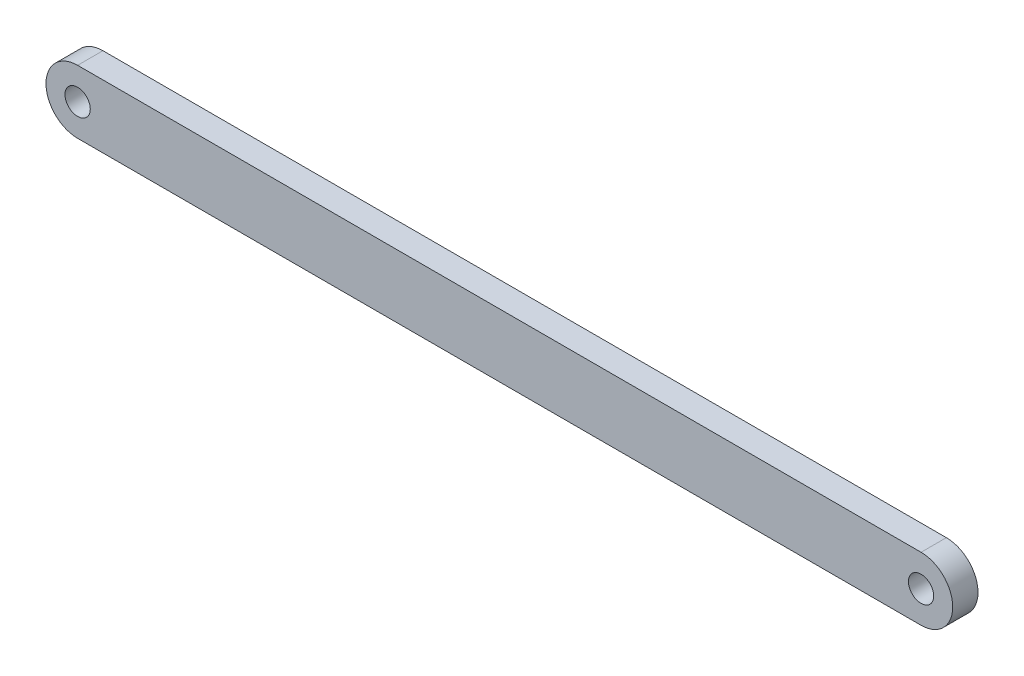
ISO-10303-21;
HEADER;
FILE_DESCRIPTION(('STEP AP214'),'2;1');
FILE_NAME('part.step','',(''),(''),'','','');
FILE_SCHEMA(('AUTOMOTIVE_DESIGN { 1 0 10303 214 1 1 1 1 }'));
ENDSEC;
DATA;
#1=APPLICATION_CONTEXT('core data for automotive mechanical design processes');
#2=APPLICATION_PROTOCOL_DEFINITION('international standard','automotive_design',2000,#1);
#3=PRODUCT_CONTEXT('',#1,'mechanical');
#4=PRODUCT('Part','Part','',(#3));
#5=PRODUCT_RELATED_PRODUCT_CATEGORY('part','',(#4));
#6=PRODUCT_DEFINITION_FORMATION('','',#4);
#7=PRODUCT_DEFINITION_CONTEXT('part definition',#1,'design');
#8=PRODUCT_DEFINITION('design','',#6,#7);
#9=PRODUCT_DEFINITION_SHAPE('','',#8);
#10=(LENGTH_UNIT() NAMED_UNIT(*) SI_UNIT(.MILLI.,.METRE.));
#11=(NAMED_UNIT(*) PLANE_ANGLE_UNIT() SI_UNIT($,.RADIAN.));
#12=(NAMED_UNIT(*) SI_UNIT($,.STERADIAN.) SOLID_ANGLE_UNIT());
#13=UNCERTAINTY_MEASURE_WITH_UNIT(LENGTH_MEASURE(1.E-05),#10,'distance_accuracy_value','');
#14=(GEOMETRIC_REPRESENTATION_CONTEXT(3) GLOBAL_UNCERTAINTY_ASSIGNED_CONTEXT((#13)) GLOBAL_UNIT_ASSIGNED_CONTEXT((#10,
#11,#12)) REPRESENTATION_CONTEXT('',''));
#15=CARTESIAN_POINT('',(0.,0.,0.));
#16=DIRECTION('',(0.,0.,1.));
#17=DIRECTION('',(1.,0.,0.));
#18=AXIS2_PLACEMENT_3D('',#15,#16,#17);
#19=CARTESIAN_POINT('',(0.,0.,3.));
#20=DIRECTION('',(0.,0.,-1.));
#21=DIRECTION('',(-1.,0.,0.));
#22=AXIS2_PLACEMENT_3D('',#19,#20,#21);
#23=CYLINDRICAL_SURFACE('',#22,3.75);
#24=CARTESIAN_POINT('',(0.,0.,0.));
#25=DIRECTION('',(0.,0.,1.));
#26=DIRECTION('',(1.,0.,0.));
#27=AXIS2_PLACEMENT_3D('',#24,#25,#26);
#28=CIRCLE('',#27,3.75);
#29=CARTESIAN_POINT('',(0.,3.75,0.));
#30=VERTEX_POINT('',#29);
#31=CARTESIAN_POINT('',(0.,-3.75,0.));
#32=VERTEX_POINT('',#31);
#33=EDGE_CURVE('E121',#30,#32,#28,.T.);
#34=ORIENTED_EDGE('',*,*,#33,.T.);
#35=DIRECTION('',(0.,0.,-1.));
#36=VECTOR('',#35,1.);
#37=CARTESIAN_POINT('',(0.,-3.75,3.));
#38=LINE('',#37,#36);
#39=CARTESIAN_POINT('',(0.,-3.75,3.));
#40=VERTEX_POINT('',#39);
#41=EDGE_CURVE('E11',#40,#32,#38,.T.);
#42=ORIENTED_EDGE('',*,*,#41,.F.);
#43=CARTESIAN_POINT('',(0.,0.,3.));
#44=DIRECTION('',(0.,0.,1.));
#45=DIRECTION('',(1.,0.,0.));
#46=AXIS2_PLACEMENT_3D('',#43,#44,#45);
#47=CIRCLE('',#46,3.75);
#48=CARTESIAN_POINT('',(0.,3.75,3.));
#49=VERTEX_POINT('',#48);
#50=EDGE_CURVE('E97',#49,#40,#47,.T.);
#51=ORIENTED_EDGE('',*,*,#50,.F.);
#52=DIRECTION('',(0.,0.,-1.));
#53=VECTOR('',#52,1.);
#54=CARTESIAN_POINT('',(0.,3.75,3.));
#55=LINE('',#54,#53);
#56=EDGE_CURVE('E116',#49,#30,#55,.T.);
#57=ORIENTED_EDGE('',*,*,#56,.T.);
#58=EDGE_LOOP('',(#34,#42,#51,#57));
#59=FACE_BOUND('',#58,.T.);
#60=ADVANCED_FACE('F43',(#59),#23,.T.);
#61=CARTESIAN_POINT('',(0.,-3.75,3.));
#62=DIRECTION('',(0.,1.,0.));
#63=DIRECTION('',(0.,0.,1.));
#64=AXIS2_PLACEMENT_3D('',#61,#62,#63);
#65=PLANE('',#64);
#66=DIRECTION('',(1.,0.,0.));
#67=VECTOR('',#66,1.);
#68=CARTESIAN_POINT('',(0.,-3.75,0.));
#69=LINE('',#68,#67);
#70=CARTESIAN_POINT('',(100.,-3.75,0.));
#71=VERTEX_POINT('',#70);
#72=EDGE_CURVE('E102',#32,#71,#69,.T.);
#73=ORIENTED_EDGE('',*,*,#72,.T.);
#74=DIRECTION('',(0.,0.,-1.));
#75=VECTOR('',#74,1.);
#76=CARTESIAN_POINT('',(100.,-3.75,3.));
#77=LINE('',#76,#75);
#78=CARTESIAN_POINT('',(100.,-3.75,3.));
#79=VERTEX_POINT('',#78);
#80=EDGE_CURVE('E53',#79,#71,#77,.T.);
#81=ORIENTED_EDGE('',*,*,#80,.F.);
#82=DIRECTION('',(1.,0.,0.));
#83=VECTOR('',#82,1.);
#84=CARTESIAN_POINT('',(0.,-3.75,3.));
#85=LINE('',#84,#83);
#86=EDGE_CURVE('E91',#40,#79,#85,.T.);
#87=ORIENTED_EDGE('',*,*,#86,.F.);
#88=ORIENTED_EDGE('',*,*,#41,.T.);
#89=EDGE_LOOP('',(#73,#81,#87,#88));
#90=FACE_BOUND('',#89,.T.);
#91=ADVANCED_FACE('F101',(#90),#65,.F.);
#92=CARTESIAN_POINT('',(100.,0.,3.));
#93=DIRECTION('',(0.,0.,-1.));
#94=DIRECTION('',(-1.,0.,0.));
#95=AXIS2_PLACEMENT_3D('',#92,#93,#94);
#96=CYLINDRICAL_SURFACE('',#95,3.75000000000001);
#97=CARTESIAN_POINT('',(100.,0.,0.));
#98=DIRECTION('',(0.,0.,1.));
#99=DIRECTION('',(1.,0.,0.));
#100=AXIS2_PLACEMENT_3D('',#97,#98,#99);
#101=CIRCLE('',#100,3.75000000000001);
#102=CARTESIAN_POINT('',(100.,3.75,0.));
#103=VERTEX_POINT('',#102);
#104=EDGE_CURVE('E78',#71,#103,#101,.T.);
#105=ORIENTED_EDGE('',*,*,#104,.T.);
#106=DIRECTION('',(0.,0.,-1.));
#107=VECTOR('',#106,1.);
#108=CARTESIAN_POINT('',(100.,3.75,3.));
#109=LINE('',#108,#107);
#110=CARTESIAN_POINT('',(100.,3.75,3.));
#111=VERTEX_POINT('',#110);
#112=EDGE_CURVE('E104',#111,#103,#109,.T.);
#113=ORIENTED_EDGE('',*,*,#112,.F.);
#114=CARTESIAN_POINT('',(100.,0.,3.));
#115=DIRECTION('',(0.,0.,1.));
#116=DIRECTION('',(1.,0.,0.));
#117=AXIS2_PLACEMENT_3D('',#114,#115,#116);
#118=CIRCLE('',#117,3.75000000000001);
#119=EDGE_CURVE('E95',#79,#111,#118,.T.);
#120=ORIENTED_EDGE('',*,*,#119,.F.);
#121=ORIENTED_EDGE('',*,*,#80,.T.);
#122=EDGE_LOOP('',(#105,#113,#120,#121));
#123=FACE_BOUND('',#122,.T.);
#124=ADVANCED_FACE('F105',(#123),#96,.T.);
#125=CARTESIAN_POINT('',(0.,3.75,3.));
#126=DIRECTION('',(0.,-1.,0.));
#127=DIRECTION('',(0.,0.,-1.));
#128=AXIS2_PLACEMENT_3D('',#125,#126,#127);
#129=PLANE('',#128);
#130=DIRECTION('',(-1.,0.,0.));
#131=VECTOR('',#130,1.);
#132=CARTESIAN_POINT('',(0.,3.75,0.));
#133=LINE('',#132,#131);
#134=EDGE_CURVE('E84',#103,#30,#133,.T.);
#135=ORIENTED_EDGE('',*,*,#134,.T.);
#136=ORIENTED_EDGE('',*,*,#56,.F.);
#137=DIRECTION('',(-1.,0.,0.));
#138=VECTOR('',#137,1.);
#139=CARTESIAN_POINT('',(0.,3.75,3.));
#140=LINE('',#139,#138);
#141=EDGE_CURVE('E61',#111,#49,#140,.T.);
#142=ORIENTED_EDGE('',*,*,#141,.F.);
#143=ORIENTED_EDGE('',*,*,#112,.T.);
#144=EDGE_LOOP('',(#135,#136,#142,#143));
#145=FACE_BOUND('',#144,.T.);
#146=ADVANCED_FACE('F139',(#145),#129,.F.);
#147=CARTESIAN_POINT('',(0.,0.,3.));
#148=DIRECTION('',(0.,0.,-1.));
#149=DIRECTION('',(-1.,0.,0.));
#150=AXIS2_PLACEMENT_3D('',#147,#148,#149);
#151=CYLINDRICAL_SURFACE('',#150,1.5);
#152=CARTESIAN_POINT('',(0.,0.,3.));
#153=DIRECTION('',(0.,0.,1.));
#154=DIRECTION('',(1.,0.,0.));
#155=AXIS2_PLACEMENT_3D('',#152,#153,#154);
#156=CIRCLE('',#155,1.5);
#157=CARTESIAN_POINT('',(1.5,0.,3.));
#158=VERTEX_POINT('',#157);
#159=EDGE_CURVE('E135',#158,#158,#156,.T.);
#160=ORIENTED_EDGE('',*,*,#159,.T.);
#161=EDGE_LOOP('',(#160));
#162=FACE_BOUND('',#161,.T.);
#163=CARTESIAN_POINT('',(0.,0.,0.));
#164=DIRECTION('',(0.,0.,1.));
#165=DIRECTION('',(1.,0.,0.));
#166=AXIS2_PLACEMENT_3D('',#163,#164,#165);
#167=CIRCLE('',#166,1.5);
#168=CARTESIAN_POINT('',(1.5,0.,0.));
#169=VERTEX_POINT('',#168);
#170=EDGE_CURVE('E117',#169,#169,#167,.T.);
#171=ORIENTED_EDGE('',*,*,#170,.F.);
#172=EDGE_LOOP('',(#171));
#173=FACE_BOUND('',#172,.T.);
#174=ADVANCED_FACE('F45',(#162,#173),#151,.F.);
#175=CARTESIAN_POINT('',(100.,0.,3.));
#176=DIRECTION('',(0.,0.,-1.));
#177=DIRECTION('',(-1.,0.,0.));
#178=AXIS2_PLACEMENT_3D('',#175,#176,#177);
#179=CYLINDRICAL_SURFACE('',#178,1.5);
#180=CARTESIAN_POINT('',(100.,0.,3.));
#181=DIRECTION('',(0.,0.,1.));
#182=DIRECTION('',(1.,0.,0.));
#183=AXIS2_PLACEMENT_3D('',#180,#181,#182);
#184=CIRCLE('',#183,1.5);
#185=CARTESIAN_POINT('',(101.5,0.,3.));
#186=VERTEX_POINT('',#185);
#187=EDGE_CURVE('E109',#186,#186,#184,.T.);
#188=ORIENTED_EDGE('',*,*,#187,.T.);
#189=EDGE_LOOP('',(#188));
#190=FACE_BOUND('',#189,.T.);
#191=CARTESIAN_POINT('',(100.,0.,0.));
#192=DIRECTION('',(0.,0.,1.));
#193=DIRECTION('',(1.,0.,0.));
#194=AXIS2_PLACEMENT_3D('',#191,#192,#193);
#195=CIRCLE('',#194,1.5);
#196=CARTESIAN_POINT('',(101.5,0.,0.));
#197=VERTEX_POINT('',#196);
#198=EDGE_CURVE('E131',#197,#197,#195,.T.);
#199=ORIENTED_EDGE('',*,*,#198,.F.);
#200=EDGE_LOOP('',(#199));
#201=FACE_BOUND('',#200,.T.);
#202=ADVANCED_FACE('F154',(#190,#201),#179,.F.);
#203=CARTESIAN_POINT('',(0.,0.,3.));
#204=DIRECTION('',(0.,0.,1.));
#205=DIRECTION('',(1.,0.,0.));
#206=AXIS2_PLACEMENT_3D('',#203,#204,#205);
#207=PLANE('',#206);
#208=ORIENTED_EDGE('',*,*,#159,.F.);
#209=EDGE_LOOP('',(#208));
#210=FACE_BOUND('',#209,.T.);
#211=ORIENTED_EDGE('',*,*,#50,.T.);
#212=ORIENTED_EDGE('',*,*,#86,.T.);
#213=ORIENTED_EDGE('',*,*,#119,.T.);
#214=ORIENTED_EDGE('',*,*,#141,.T.);
#215=EDGE_LOOP('',(#211,#212,#213,#214));
#216=FACE_BOUND('',#215,.T.);
#217=ORIENTED_EDGE('',*,*,#187,.F.);
#218=EDGE_LOOP('',(#217));
#219=FACE_BOUND('',#218,.T.);
#220=ADVANCED_FACE('F92',(#210,#216,#219),#207,.T.);
#221=CARTESIAN_POINT('',(0.,0.,0.));
#222=DIRECTION('',(0.,0.,1.));
#223=DIRECTION('',(1.,0.,0.));
#224=AXIS2_PLACEMENT_3D('',#221,#222,#223);
#225=PLANE('',#224);
#226=ORIENTED_EDGE('',*,*,#170,.T.);
#227=EDGE_LOOP('',(#226));
#228=FACE_BOUND('',#227,.T.);
#229=ORIENTED_EDGE('',*,*,#33,.F.);
#230=ORIENTED_EDGE('',*,*,#134,.F.);
#231=ORIENTED_EDGE('',*,*,#104,.F.);
#232=ORIENTED_EDGE('',*,*,#72,.F.);
#233=EDGE_LOOP('',(#229,#230,#231,#232));
#234=FACE_BOUND('',#233,.T.);
#235=ORIENTED_EDGE('',*,*,#198,.T.);
#236=EDGE_LOOP('',(#235));
#237=FACE_BOUND('',#236,.T.);
#238=ADVANCED_FACE('F142',(#228,#234,#237),#225,.F.);
#239=CLOSED_SHELL('',(#60,#91,#124,#146,#174,#202,#220,#238));
#240=MANIFOLD_SOLID_BREP('B2',#239);
#241=ADVANCED_BREP_SHAPE_REPRESENTATION('',(#18,#240),#14);
#242=SHAPE_DEFINITION_REPRESENTATION(#9,#241);
ENDSEC;
END-ISO-10303-21;
